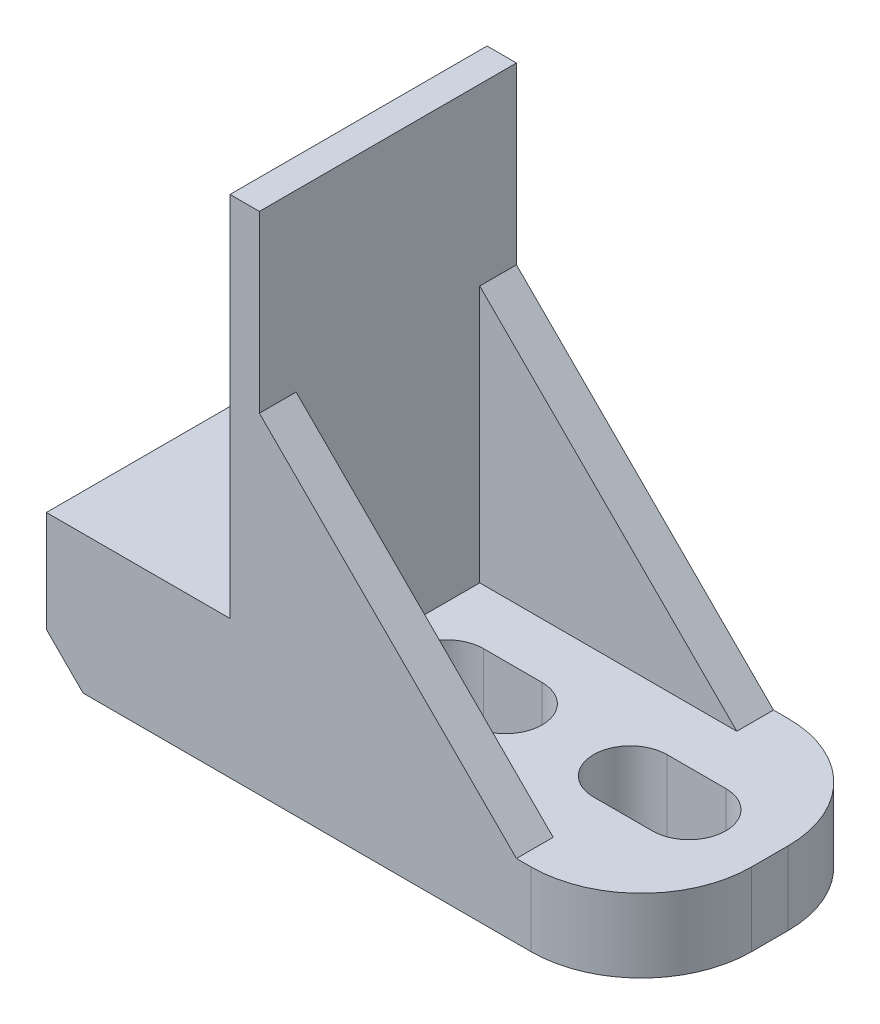
ISO-10303-21;
HEADER;
FILE_DESCRIPTION(('STEP AP214'),'2;1');
FILE_NAME('part.step','',(''),(''),'','','');
FILE_SCHEMA(('AUTOMOTIVE_DESIGN { 1 0 10303 214 1 1 1 1 }'));
ENDSEC;
DATA;
#1=APPLICATION_CONTEXT('core data for automotive mechanical design processes');
#2=APPLICATION_PROTOCOL_DEFINITION('international standard','automotive_design',2000,#1);
#3=PRODUCT_CONTEXT('',#1,'mechanical');
#4=PRODUCT('Part','Part','',(#3));
#5=PRODUCT_RELATED_PRODUCT_CATEGORY('part','',(#4));
#6=PRODUCT_DEFINITION_FORMATION('','',#4);
#7=PRODUCT_DEFINITION_CONTEXT('part definition',#1,'design');
#8=PRODUCT_DEFINITION('design','',#6,#7);
#9=PRODUCT_DEFINITION_SHAPE('','',#8);
#10=(LENGTH_UNIT() NAMED_UNIT(*) SI_UNIT(.MILLI.,.METRE.));
#11=(NAMED_UNIT(*) PLANE_ANGLE_UNIT() SI_UNIT($,.RADIAN.));
#12=(NAMED_UNIT(*) SI_UNIT($,.STERADIAN.) SOLID_ANGLE_UNIT());
#13=UNCERTAINTY_MEASURE_WITH_UNIT(LENGTH_MEASURE(1.E-05),#10,'distance_accuracy_value','');
#14=(GEOMETRIC_REPRESENTATION_CONTEXT(3) GLOBAL_UNCERTAINTY_ASSIGNED_CONTEXT((#13)) GLOBAL_UNIT_ASSIGNED_CONTEXT((#10,
#11,#12)) REPRESENTATION_CONTEXT('',''));
#15=CARTESIAN_POINT('',(0.,0.,0.));
#16=DIRECTION('',(0.,0.,1.));
#17=DIRECTION('',(1.,0.,0.));
#18=AXIS2_PLACEMENT_3D('',#15,#16,#17);
#19=CARTESIAN_POINT('',(-93.5405405405406,-10.2324324324324,35.));
#20=DIRECTION('',(0.,-1.,0.));
#21=DIRECTION('',(1.,0.,0.));
#22=AXIS2_PLACEMENT_3D('',#19,#20,#21);
#23=PLANE('',#22);
#24=DIRECTION('',(-1.,0.,0.));
#25=VECTOR('',#24,1.);
#26=CARTESIAN_POINT('',(-93.5405405405406,-10.2324324324324,22.5));
#27=LINE('',#26,#25);
#28=CARTESIAN_POINT('',(-77.5405405405406,-10.2324324324324,22.5));
#29=VERTEX_POINT('',#28);
#30=CARTESIAN_POINT('',(-85.5405405405406,-10.2324324324324,22.5));
#31=VERTEX_POINT('',#30);
#32=EDGE_CURVE('E265',#29,#31,#27,.T.);
#33=ORIENTED_EDGE('',*,*,#32,.T.);
#34=CARTESIAN_POINT('',(-85.5405405405406,-10.2324324324324,17.5));
#35=DIRECTION('',(0.,-1.,0.));
#36=DIRECTION('',(1.,0.,0.));
#37=AXIS2_PLACEMENT_3D('',#34,#35,#36);
#38=CIRCLE('',#37,5.);
#39=CARTESIAN_POINT('',(-85.5405405405406,-10.2324324324324,12.5));
#40=VERTEX_POINT('',#39);
#41=EDGE_CURVE('E202',#31,#40,#38,.T.);
#42=ORIENTED_EDGE('',*,*,#41,.T.);
#43=DIRECTION('',(1.,0.,0.));
#44=VECTOR('',#43,1.);
#45=CARTESIAN_POINT('',(-93.5405405405406,-10.2324324324324,12.5));
#46=LINE('',#45,#44);
#47=CARTESIAN_POINT('',(-77.5405405405406,-10.2324324324324,12.5));
#48=VERTEX_POINT('',#47);
#49=EDGE_CURVE('E270',#40,#48,#46,.T.);
#50=ORIENTED_EDGE('',*,*,#49,.T.);
#51=CARTESIAN_POINT('',(-77.5405405405406,-10.2324324324324,17.5));
#52=DIRECTION('',(0.,-1.,0.));
#53=DIRECTION('',(1.,0.,0.));
#54=AXIS2_PLACEMENT_3D('',#51,#52,#53);
#55=CIRCLE('',#54,5.);
#56=EDGE_CURVE('E267',#48,#29,#55,.T.);
#57=ORIENTED_EDGE('',*,*,#56,.T.);
#58=EDGE_LOOP('',(#33,#42,#50,#57));
#59=FACE_BOUND('',#58,.T.);
#60=DIRECTION('',(-1.,0.,0.));
#61=VECTOR('',#60,1.);
#62=CARTESIAN_POINT('',(-93.5405405405406,-10.2324324324324,22.5));
#63=LINE('',#62,#61);
#64=CARTESIAN_POINT('',(-52.5405405405406,-10.2324324324324,22.5));
#65=VERTEX_POINT('',#64);
#66=CARTESIAN_POINT('',(-60.5405405405406,-10.2324324324324,22.5));
#67=VERTEX_POINT('',#66);
#68=EDGE_CURVE('E230',#65,#67,#63,.T.);
#69=ORIENTED_EDGE('',*,*,#68,.T.);
#70=CARTESIAN_POINT('',(-60.5405405405406,-10.2324324324324,17.5));
#71=DIRECTION('',(0.,-1.,0.));
#72=DIRECTION('',(1.,0.,0.));
#73=AXIS2_PLACEMENT_3D('',#70,#71,#72);
#74=CIRCLE('',#73,5.);
#75=CARTESIAN_POINT('',(-60.5405405405406,-10.2324324324324,12.5));
#76=VERTEX_POINT('',#75);
#77=EDGE_CURVE('E262',#67,#76,#74,.T.);
#78=ORIENTED_EDGE('',*,*,#77,.T.);
#79=DIRECTION('',(1.,0.,0.));
#80=VECTOR('',#79,1.);
#81=CARTESIAN_POINT('',(-93.5405405405406,-10.2324324324324,12.5));
#82=LINE('',#81,#80);
#83=CARTESIAN_POINT('',(-52.5405405405406,-10.2324324324324,12.5));
#84=VERTEX_POINT('',#83);
#85=EDGE_CURVE('E259',#76,#84,#82,.T.);
#86=ORIENTED_EDGE('',*,*,#85,.T.);
#87=CARTESIAN_POINT('',(-52.5405405405406,-10.2324324324324,17.5));
#88=DIRECTION('',(0.,-1.,0.));
#89=DIRECTION('',(1.,0.,0.));
#90=AXIS2_PLACEMENT_3D('',#87,#88,#89);
#91=CIRCLE('',#90,5.);
#92=EDGE_CURVE('E256',#84,#65,#91,.T.);
#93=ORIENTED_EDGE('',*,*,#92,.T.);
#94=EDGE_LOOP('',(#69,#78,#86,#93));
#95=FACE_BOUND('',#94,.T.);
#96=DIRECTION('',(0.,0.,-1.));
#97=VECTOR('',#96,1.);
#98=CARTESIAN_POINT('',(-41.5405405405406,-10.2324324324324,35.));
#99=LINE('',#98,#97);
#100=CARTESIAN_POINT('',(-41.5405405405406,-10.2324324324324,20.));
#101=VERTEX_POINT('',#100);
#102=CARTESIAN_POINT('',(-41.5405405405406,-10.2324324324324,15.));
#103=VERTEX_POINT('',#102);
#104=EDGE_CURVE('E355',#101,#103,#99,.T.);
#105=ORIENTED_EDGE('',*,*,#104,.T.);
#106=CARTESIAN_POINT('',(-56.5405405405406,-10.2324324324324,15.));
#107=DIRECTION('',(0.,-1.,0.));
#108=DIRECTION('',(1.,0.,0.));
#109=AXIS2_PLACEMENT_3D('',#106,#107,#108);
#110=CIRCLE('',#109,15.);
#111=CARTESIAN_POINT('',(-56.5405405405406,-10.2324324324324,0.));
#112=VERTEX_POINT('',#111);
#113=EDGE_CURVE('E374',#103,#112,#110,.F.);
#114=ORIENTED_EDGE('',*,*,#113,.T.);
#115=DIRECTION('',(-1.,0.,0.));
#116=VECTOR('',#115,1.);
#117=CARTESIAN_POINT('',(-93.5405405405406,-10.2324324324324,0.));
#118=LINE('',#117,#116);
#119=CARTESIAN_POINT('',(-58.5405405405406,-10.2324324324324,0.));
#120=VERTEX_POINT('',#119);
#121=EDGE_CURVE('E308',#112,#120,#118,.T.);
#122=ORIENTED_EDGE('',*,*,#121,.T.);
#123=DIRECTION('',(0.,0.,-1.));
#124=VECTOR('',#123,1.);
#125=CARTESIAN_POINT('',(-58.5405405405406,-10.2324324324324,5.));
#126=LINE('',#125,#124);
#127=CARTESIAN_POINT('',(-58.5405405405406,-10.2324324324324,5.));
#128=VERTEX_POINT('',#127);
#129=EDGE_CURVE('E301',#128,#120,#126,.T.);
#130=ORIENTED_EDGE('',*,*,#129,.F.);
#131=DIRECTION('',(1.,0.,0.));
#132=VECTOR('',#131,1.);
#133=CARTESIAN_POINT('',(-93.5405405405406,-10.2324324324324,5.));
#134=LINE('',#133,#132);
#135=CARTESIAN_POINT('',(-93.5405405405406,-10.2324324324324,5.));
#136=VERTEX_POINT('',#135);
#137=EDGE_CURVE('E298',#136,#128,#134,.T.);
#138=ORIENTED_EDGE('',*,*,#137,.F.);
#139=DIRECTION('',(0.,0.,-1.));
#140=VECTOR('',#139,1.);
#141=CARTESIAN_POINT('',(-93.5405405405406,-10.2324324324324,35.));
#142=LINE('',#141,#140);
#143=CARTESIAN_POINT('',(-93.5405405405406,-10.2324324324324,30.));
#144=VERTEX_POINT('',#143);
#145=EDGE_CURVE('E353',#144,#136,#142,.T.);
#146=ORIENTED_EDGE('',*,*,#145,.F.);
#147=DIRECTION('',(1.,0.,0.));
#148=VECTOR('',#147,1.);
#149=CARTESIAN_POINT('',(0.,-10.2324324324324,30.));
#150=LINE('',#149,#148);
#151=CARTESIAN_POINT('',(-58.5405405405406,-10.2324324324324,30.));
#152=VERTEX_POINT('',#151);
#153=EDGE_CURVE('E281',#144,#152,#150,.T.);
#154=ORIENTED_EDGE('',*,*,#153,.T.);
#155=DIRECTION('',(0.,0.,1.));
#156=VECTOR('',#155,1.);
#157=CARTESIAN_POINT('',(-58.5405405405406,-10.2324324324324,30.));
#158=LINE('',#157,#156);
#159=CARTESIAN_POINT('',(-58.5405405405406,-10.2324324324324,35.));
#160=VERTEX_POINT('',#159);
#161=EDGE_CURVE('E286',#152,#160,#158,.T.);
#162=ORIENTED_EDGE('',*,*,#161,.T.);
#163=DIRECTION('',(-1.,0.,0.));
#164=VECTOR('',#163,1.);
#165=CARTESIAN_POINT('',(-93.5405405405406,-10.2324324324324,35.));
#166=LINE('',#165,#164);
#167=CARTESIAN_POINT('',(-56.5405405405406,-10.2324324324324,35.));
#168=VERTEX_POINT('',#167);
#169=EDGE_CURVE('E309',#168,#160,#166,.T.);
#170=ORIENTED_EDGE('',*,*,#169,.F.);
#171=CARTESIAN_POINT('',(-56.5405405405406,-10.2324324324324,20.));
#172=DIRECTION('',(0.,-1.,0.));
#173=DIRECTION('',(1.,0.,0.));
#174=AXIS2_PLACEMENT_3D('',#171,#172,#173);
#175=CIRCLE('',#174,15.);
#176=EDGE_CURVE('E372',#168,#101,#175,.F.);
#177=ORIENTED_EDGE('',*,*,#176,.T.);
#178=EDGE_LOOP('',(#105,#114,#122,#130,#138,#146,#154,#162,#170,#177));
#179=FACE_BOUND('',#178,.T.);
#180=ADVANCED_FACE('F35',(#59,#95,#179),#23,.F.);
#181=CARTESIAN_POINT('',(-93.5405405405406,48.5675675675676,35.));
#182=DIRECTION('',(-1.,0.,0.));
#183=DIRECTION('',(0.,0.,1.));
#184=AXIS2_PLACEMENT_3D('',#181,#182,#183);
#185=PLANE('',#184);
#186=DIRECTION('',(0.,1.,0.));
#187=VECTOR('',#186,1.);
#188=CARTESIAN_POINT('',(-93.5405405405406,48.5675675675676,35.));
#189=LINE('',#188,#187);
#190=CARTESIAN_POINT('',(-93.5405405405406,24.7675675675676,35.));
#191=VERTEX_POINT('',#190);
#192=CARTESIAN_POINT('',(-93.5405405405406,48.5675675675676,35.));
#193=VERTEX_POINT('',#192);
#194=EDGE_CURVE('E311',#191,#193,#189,.T.);
#195=ORIENTED_EDGE('',*,*,#194,.F.);
#196=DIRECTION('',(0.,0.,1.));
#197=VECTOR('',#196,1.);
#198=CARTESIAN_POINT('',(-93.5405405405406,24.7675675675676,30.));
#199=LINE('',#198,#197);
#200=CARTESIAN_POINT('',(-93.5405405405406,24.7675675675676,30.));
#201=VERTEX_POINT('',#200);
#202=EDGE_CURVE('E284',#201,#191,#199,.T.);
#203=ORIENTED_EDGE('',*,*,#202,.F.);
#204=DIRECTION('',(0.,-1.,0.));
#205=VECTOR('',#204,1.);
#206=CARTESIAN_POINT('',(-93.5405405405406,0.,30.));
#207=LINE('',#206,#205);
#208=EDGE_CURVE('E278',#201,#144,#207,.T.);
#209=ORIENTED_EDGE('',*,*,#208,.T.);
#210=ORIENTED_EDGE('',*,*,#145,.T.);
#211=DIRECTION('',(0.,-1.,0.));
#212=VECTOR('',#211,1.);
#213=CARTESIAN_POINT('',(-93.5405405405406,24.7675675675676,5.));
#214=LINE('',#213,#212);
#215=CARTESIAN_POINT('',(-93.5405405405406,24.7675675675676,5.));
#216=VERTEX_POINT('',#215);
#217=EDGE_CURVE('E295',#216,#136,#214,.T.);
#218=ORIENTED_EDGE('',*,*,#217,.F.);
#219=DIRECTION('',(0.,0.,-1.));
#220=VECTOR('',#219,1.);
#221=CARTESIAN_POINT('',(-93.5405405405406,24.7675675675676,5.));
#222=LINE('',#221,#220);
#223=CARTESIAN_POINT('',(-93.5405405405406,24.7675675675676,0.));
#224=VERTEX_POINT('',#223);
#225=EDGE_CURVE('E306',#216,#224,#222,.T.);
#226=ORIENTED_EDGE('',*,*,#225,.T.);
#227=DIRECTION('',(0.,1.,0.));
#228=VECTOR('',#227,1.);
#229=CARTESIAN_POINT('',(-93.5405405405406,48.5675675675676,0.));
#230=LINE('',#229,#228);
#231=CARTESIAN_POINT('',(-93.5405405405406,48.5675675675676,0.));
#232=VERTEX_POINT('',#231);
#233=EDGE_CURVE('E327',#224,#232,#230,.T.);
#234=ORIENTED_EDGE('',*,*,#233,.T.);
#235=DIRECTION('',(0.,0.,-1.));
#236=VECTOR('',#235,1.);
#237=CARTESIAN_POINT('',(-93.5405405405406,48.5675675675676,35.));
#238=LINE('',#237,#236);
#239=EDGE_CURVE('E350',#193,#232,#238,.T.);
#240=ORIENTED_EDGE('',*,*,#239,.F.);
#241=EDGE_LOOP('',(#195,#203,#209,#210,#218,#226,#234,#240));
#242=FACE_BOUND('',#241,.T.);
#243=ADVANCED_FACE('F400',(#242),#185,.F.);
#244=CARTESIAN_POINT('',(-41.5405405405406,-10.2324324324324,35.));
#245=DIRECTION('',(-1.,0.,0.));
#246=DIRECTION('',(0.,0.,1.));
#247=AXIS2_PLACEMENT_3D('',#244,#245,#246);
#248=PLANE('',#247);
#249=DIRECTION('',(0.,0.,-1.));
#250=VECTOR('',#249,1.);
#251=CARTESIAN_POINT('',(-41.5405405405406,-20.2324324324324,35.));
#252=LINE('',#251,#250);
#253=CARTESIAN_POINT('',(-41.5405405405406,-20.2324324324324,20.));
#254=VERTEX_POINT('',#253);
#255=CARTESIAN_POINT('',(-41.5405405405406,-20.2324324324324,15.));
#256=VERTEX_POINT('',#255);
#257=EDGE_CURVE('E325',#254,#256,#252,.T.);
#258=ORIENTED_EDGE('',*,*,#257,.T.);
#259=DIRECTION('',(0.,1.,0.));
#260=VECTOR('',#259,1.);
#261=CARTESIAN_POINT('',(-41.5405405405406,-10.2324324324324,15.));
#262=LINE('',#261,#260);
#263=EDGE_CURVE('E369',#256,#103,#262,.T.);
#264=ORIENTED_EDGE('',*,*,#263,.T.);
#265=ORIENTED_EDGE('',*,*,#104,.F.);
#266=DIRECTION('',(0.,1.,0.));
#267=VECTOR('',#266,1.);
#268=CARTESIAN_POINT('',(-41.5405405405406,-10.2324324324324,20.));
#269=LINE('',#268,#267);
#270=EDGE_CURVE('E367',#101,#254,#269,.F.);
#271=ORIENTED_EDGE('',*,*,#270,.T.);
#272=EDGE_LOOP('',(#258,#264,#265,#271));
#273=FACE_BOUND('',#272,.T.);
#274=ADVANCED_FACE('F381',(#273),#248,.F.);
#275=CARTESIAN_POINT('',(-97.5405405405406,48.5675675675676,35.));
#276=DIRECTION('',(0.,-1.,0.));
#277=DIRECTION('',(0.,0.,-1.));
#278=AXIS2_PLACEMENT_3D('',#275,#276,#277);
#279=PLANE('',#278);
#280=DIRECTION('',(-1.,0.,0.));
#281=VECTOR('',#280,1.);
#282=CARTESIAN_POINT('',(-97.5405405405406,48.5675675675676,0.));
#283=LINE('',#282,#281);
#284=CARTESIAN_POINT('',(-97.5405405405406,48.5675675675676,0.));
#285=VERTEX_POINT('',#284);
#286=EDGE_CURVE('E329',#232,#285,#283,.T.);
#287=ORIENTED_EDGE('',*,*,#286,.T.);
#288=DIRECTION('',(0.,0.,-1.));
#289=VECTOR('',#288,1.);
#290=CARTESIAN_POINT('',(-97.5405405405406,48.5675675675676,35.));
#291=LINE('',#290,#289);
#292=CARTESIAN_POINT('',(-97.5405405405406,48.5675675675676,35.));
#293=VERTEX_POINT('',#292);
#294=EDGE_CURVE('E347',#293,#285,#291,.T.);
#295=ORIENTED_EDGE('',*,*,#294,.F.);
#296=DIRECTION('',(-1.,0.,0.));
#297=VECTOR('',#296,1.);
#298=CARTESIAN_POINT('',(-97.5405405405406,48.5675675675676,35.));
#299=LINE('',#298,#297);
#300=EDGE_CURVE('E314',#193,#293,#299,.T.);
#301=ORIENTED_EDGE('',*,*,#300,.F.);
#302=ORIENTED_EDGE('',*,*,#239,.T.);
#303=EDGE_LOOP('',(#287,#295,#301,#302));
#304=FACE_BOUND('',#303,.T.);
#305=ADVANCED_FACE('F434',(#304),#279,.F.);
#306=CARTESIAN_POINT('',(-97.5405405405406,-1.43243243243243,35.));
#307=DIRECTION('',(1.,0.,0.));
#308=DIRECTION('',(0.,0.,-1.));
#309=AXIS2_PLACEMENT_3D('',#306,#307,#308);
#310=PLANE('',#309);
#311=DIRECTION('',(0.,-1.,0.));
#312=VECTOR('',#311,1.);
#313=CARTESIAN_POINT('',(-97.5405405405406,-1.43243243243243,0.));
#314=LINE('',#313,#312);
#315=CARTESIAN_POINT('',(-97.5405405405406,-1.43243243243243,0.));
#316=VERTEX_POINT('',#315);
#317=EDGE_CURVE('E331',#285,#316,#314,.T.);
#318=ORIENTED_EDGE('',*,*,#317,.T.);
#319=DIRECTION('',(0.,0.,-1.));
#320=VECTOR('',#319,1.);
#321=CARTESIAN_POINT('',(-97.5405405405406,-1.43243243243243,35.));
#322=LINE('',#321,#320);
#323=CARTESIAN_POINT('',(-97.5405405405406,-1.43243243243243,35.));
#324=VERTEX_POINT('',#323);
#325=EDGE_CURVE('E344',#324,#316,#322,.T.);
#326=ORIENTED_EDGE('',*,*,#325,.F.);
#327=DIRECTION('',(0.,-1.,0.));
#328=VECTOR('',#327,1.);
#329=CARTESIAN_POINT('',(-97.5405405405406,-1.43243243243243,35.));
#330=LINE('',#329,#328);
#331=EDGE_CURVE('E316',#293,#324,#330,.T.);
#332=ORIENTED_EDGE('',*,*,#331,.F.);
#333=ORIENTED_EDGE('',*,*,#294,.T.);
#334=EDGE_LOOP('',(#318,#326,#332,#333));
#335=FACE_BOUND('',#334,.T.);
#336=ADVANCED_FACE('F459',(#335),#310,.F.);
#337=CARTESIAN_POINT('',(-122.540540540541,-1.43243243243243,35.));
#338=DIRECTION('',(0.,-1.,0.));
#339=DIRECTION('',(1.,0.,0.));
#340=AXIS2_PLACEMENT_3D('',#337,#338,#339);
#341=PLANE('',#340);
#342=DIRECTION('',(-1.,0.,0.));
#343=VECTOR('',#342,1.);
#344=CARTESIAN_POINT('',(-122.540540540541,-1.43243243243243,0.));
#345=LINE('',#344,#343);
#346=CARTESIAN_POINT('',(-122.540540540541,-1.43243243243243,0.));
#347=VERTEX_POINT('',#346);
#348=EDGE_CURVE('E333',#316,#347,#345,.T.);
#349=ORIENTED_EDGE('',*,*,#348,.T.);
#350=DIRECTION('',(0.,0.,-1.));
#351=VECTOR('',#350,1.);
#352=CARTESIAN_POINT('',(-122.540540540541,-1.43243243243243,35.));
#353=LINE('',#352,#351);
#354=CARTESIAN_POINT('',(-122.540540540541,-1.43243243243243,35.));
#355=VERTEX_POINT('',#354);
#356=EDGE_CURVE('E341',#355,#347,#353,.T.);
#357=ORIENTED_EDGE('',*,*,#356,.F.);
#358=DIRECTION('',(-1.,0.,0.));
#359=VECTOR('',#358,1.);
#360=CARTESIAN_POINT('',(-122.540540540541,-1.43243243243243,35.));
#361=LINE('',#360,#359);
#362=EDGE_CURVE('E318',#324,#355,#361,.T.);
#363=ORIENTED_EDGE('',*,*,#362,.F.);
#364=ORIENTED_EDGE('',*,*,#325,.T.);
#365=EDGE_LOOP('',(#349,#357,#363,#364));
#366=FACE_BOUND('',#365,.T.);
#367=ADVANCED_FACE('F455',(#366),#341,.F.);
#368=CARTESIAN_POINT('',(-122.540540540541,-20.2324324324324,35.));
#369=DIRECTION('',(1.,0.,0.));
#370=DIRECTION('',(0.,0.,-1.));
#371=AXIS2_PLACEMENT_3D('',#368,#369,#370);
#372=PLANE('',#371);
#373=DIRECTION('',(0.,-1.,0.));
#374=VECTOR('',#373,1.);
#375=CARTESIAN_POINT('',(-122.540540540541,-20.2324324324324,0.));
#376=LINE('',#375,#374);
#377=CARTESIAN_POINT('',(-122.540540540541,-15.2324324324324,0.));
#378=VERTEX_POINT('',#377);
#379=EDGE_CURVE('E335',#347,#378,#376,.T.);
#380=ORIENTED_EDGE('',*,*,#379,.T.);
#381=DIRECTION('',(0.,0.,1.));
#382=VECTOR('',#381,1.);
#383=CARTESIAN_POINT('',(-122.540540540541,-15.2324324324324,35.));
#384=LINE('',#383,#382);
#385=CARTESIAN_POINT('',(-122.540540540541,-15.2324324324324,35.));
#386=VERTEX_POINT('',#385);
#387=EDGE_CURVE('E363',#378,#386,#384,.T.);
#388=ORIENTED_EDGE('',*,*,#387,.T.);
#389=DIRECTION('',(0.,-1.,0.));
#390=VECTOR('',#389,1.);
#391=CARTESIAN_POINT('',(-122.540540540541,-20.2324324324324,35.));
#392=LINE('',#391,#390);
#393=EDGE_CURVE('E320',#355,#386,#392,.T.);
#394=ORIENTED_EDGE('',*,*,#393,.F.);
#395=ORIENTED_EDGE('',*,*,#356,.T.);
#396=EDGE_LOOP('',(#380,#388,#394,#395));
#397=FACE_BOUND('',#396,.T.);
#398=ADVANCED_FACE('F451',(#397),#372,.F.);
#399=CARTESIAN_POINT('',(-41.5405405405406,-20.2324324324324,35.));
#400=DIRECTION('',(0.,1.,0.));
#401=DIRECTION('',(-1.,0.,0.));
#402=AXIS2_PLACEMENT_3D('',#399,#400,#401);
#403=PLANE('',#402);
#404=DIRECTION('',(-1.,0.,0.));
#405=VECTOR('',#404,1.);
#406=CARTESIAN_POINT('',(-85.5405405405406,-20.2324324324324,12.5));
#407=LINE('',#406,#405);
#408=CARTESIAN_POINT('',(-77.5405405405406,-20.2324324324324,12.5));
#409=VERTEX_POINT('',#408);
#410=CARTESIAN_POINT('',(-85.5405405405406,-20.2324324324324,12.5));
#411=VERTEX_POINT('',#410);
#412=EDGE_CURVE('E206',#409,#411,#407,.T.);
#413=ORIENTED_EDGE('',*,*,#412,.T.);
#414=CARTESIAN_POINT('',(-85.5405405405406,-20.2324324324324,17.5));
#415=DIRECTION('',(0.,1.,0.));
#416=DIRECTION('',(0.,0.,1.));
#417=AXIS2_PLACEMENT_3D('',#414,#415,#416);
#418=CIRCLE('',#417,5.);
#419=CARTESIAN_POINT('',(-85.5405405405406,-20.2324324324324,22.5));
#420=VERTEX_POINT('',#419);
#421=EDGE_CURVE('E199',#411,#420,#418,.T.);
#422=ORIENTED_EDGE('',*,*,#421,.T.);
#423=DIRECTION('',(1.,0.,0.));
#424=VECTOR('',#423,1.);
#425=CARTESIAN_POINT('',(-85.5405405405406,-20.2324324324324,22.5));
#426=LINE('',#425,#424);
#427=CARTESIAN_POINT('',(-77.5405405405406,-20.2324324324324,22.5));
#428=VERTEX_POINT('',#427);
#429=EDGE_CURVE('E210',#420,#428,#426,.T.);
#430=ORIENTED_EDGE('',*,*,#429,.T.);
#431=CARTESIAN_POINT('',(-77.5405405405406,-20.2324324324324,17.5));
#432=DIRECTION('',(0.,1.,0.));
#433=DIRECTION('',(0.,0.,1.));
#434=AXIS2_PLACEMENT_3D('',#431,#432,#433);
#435=CIRCLE('',#434,5.);
#436=EDGE_CURVE('E215',#428,#409,#435,.T.);
#437=ORIENTED_EDGE('',*,*,#436,.T.);
#438=EDGE_LOOP('',(#413,#422,#430,#437));
#439=FACE_BOUND('',#438,.T.);
#440=DIRECTION('',(-1.,0.,0.));
#441=VECTOR('',#440,1.);
#442=CARTESIAN_POINT('',(-60.5405405405406,-20.2324324324324,12.5));
#443=LINE('',#442,#441);
#444=CARTESIAN_POINT('',(-52.5405405405406,-20.2324324324324,12.5));
#445=VERTEX_POINT('',#444);
#446=CARTESIAN_POINT('',(-60.5405405405406,-20.2324324324324,12.5));
#447=VERTEX_POINT('',#446);
#448=EDGE_CURVE('E244',#445,#447,#443,.T.);
#449=ORIENTED_EDGE('',*,*,#448,.T.);
#450=CARTESIAN_POINT('',(-60.5405405405406,-20.2324324324324,17.5));
#451=DIRECTION('',(0.,1.,0.));
#452=DIRECTION('',(0.,0.,1.));
#453=AXIS2_PLACEMENT_3D('',#450,#451,#452);
#454=CIRCLE('',#453,5.);
#455=CARTESIAN_POINT('',(-60.5405405405406,-20.2324324324324,22.5));
#456=VERTEX_POINT('',#455);
#457=EDGE_CURVE('E235',#447,#456,#454,.T.);
#458=ORIENTED_EDGE('',*,*,#457,.T.);
#459=DIRECTION('',(1.,0.,0.));
#460=VECTOR('',#459,1.);
#461=CARTESIAN_POINT('',(-60.5405405405406,-20.2324324324324,22.5));
#462=LINE('',#461,#460);
#463=CARTESIAN_POINT('',(-52.5405405405406,-20.2324324324324,22.5));
#464=VERTEX_POINT('',#463);
#465=EDGE_CURVE('E238',#456,#464,#462,.T.);
#466=ORIENTED_EDGE('',*,*,#465,.T.);
#467=CARTESIAN_POINT('',(-52.5405405405406,-20.2324324324324,17.5));
#468=DIRECTION('',(0.,1.,0.));
#469=DIRECTION('',(0.,0.,1.));
#470=AXIS2_PLACEMENT_3D('',#467,#468,#469);
#471=CIRCLE('',#470,5.);
#472=EDGE_CURVE('E241',#464,#445,#471,.T.);
#473=ORIENTED_EDGE('',*,*,#472,.T.);
#474=EDGE_LOOP('',(#449,#458,#466,#473));
#475=FACE_BOUND('',#474,.T.);
#476=DIRECTION('',(1.,0.,0.));
#477=VECTOR('',#476,1.);
#478=CARTESIAN_POINT('',(-41.5405405405406,-20.2324324324324,0.));
#479=LINE('',#478,#477);
#480=CARTESIAN_POINT('',(-117.540540540541,-20.2324324324324,0.));
#481=VERTEX_POINT('',#480);
#482=CARTESIAN_POINT('',(-56.5405405405406,-20.2324324324324,0.));
#483=VERTEX_POINT('',#482);
#484=EDGE_CURVE('E312',#481,#483,#479,.T.);
#485=ORIENTED_EDGE('',*,*,#484,.T.);
#486=CARTESIAN_POINT('',(-56.5405405405406,-20.2324324324324,15.));
#487=DIRECTION('',(0.,1.,0.));
#488=DIRECTION('',(-1.,0.,0.));
#489=AXIS2_PLACEMENT_3D('',#486,#487,#488);
#490=CIRCLE('',#489,15.);
#491=EDGE_CURVE('E43',#483,#256,#490,.F.);
#492=ORIENTED_EDGE('',*,*,#491,.T.);
#493=ORIENTED_EDGE('',*,*,#257,.F.);
#494=CARTESIAN_POINT('',(-56.5405405405406,-20.2324324324324,20.));
#495=DIRECTION('',(0.,1.,0.));
#496=DIRECTION('',(-1.,0.,0.));
#497=AXIS2_PLACEMENT_3D('',#494,#495,#496);
#498=CIRCLE('',#497,15.);
#499=CARTESIAN_POINT('',(-56.5405405405406,-20.2324324324324,35.));
#500=VERTEX_POINT('',#499);
#501=EDGE_CURVE('E50',#254,#500,#498,.F.);
#502=ORIENTED_EDGE('',*,*,#501,.T.);
#503=DIRECTION('',(1.,0.,0.));
#504=VECTOR('',#503,1.);
#505=CARTESIAN_POINT('',(-41.5405405405406,-20.2324324324324,35.));
#506=LINE('',#505,#504);
#507=CARTESIAN_POINT('',(-117.540540540541,-20.2324324324324,35.));
#508=VERTEX_POINT('',#507);
#509=EDGE_CURVE('E323',#508,#500,#506,.T.);
#510=ORIENTED_EDGE('',*,*,#509,.F.);
#511=DIRECTION('',(0.,0.,-1.));
#512=VECTOR('',#511,1.);
#513=CARTESIAN_POINT('',(-117.540540540541,-20.2324324324324,35.));
#514=LINE('',#513,#512);
#515=EDGE_CURVE('E358',#508,#481,#514,.T.);
#516=ORIENTED_EDGE('',*,*,#515,.T.);
#517=EDGE_LOOP('',(#485,#492,#493,#502,#510,#516));
#518=FACE_BOUND('',#517,.T.);
#519=ADVANCED_FACE('F217',(#439,#475,#518),#403,.F.);
#520=CARTESIAN_POINT('',(0.,0.,35.));
#521=DIRECTION('',(0.,0.,-1.));
#522=DIRECTION('',(-1.,0.,0.));
#523=AXIS2_PLACEMENT_3D('',#520,#521,#522);
#524=PLANE('',#523);
#525=ORIENTED_EDGE('',*,*,#509,.T.);
#526=DIRECTION('',(0.,1.,0.));
#527=VECTOR('',#526,1.);
#528=CARTESIAN_POINT('',(-56.5405405405406,0.,35.));
#529=LINE('',#528,#527);
#530=EDGE_CURVE('E11',#500,#168,#529,.T.);
#531=ORIENTED_EDGE('',*,*,#530,.T.);
#532=ORIENTED_EDGE('',*,*,#169,.T.);
#533=DIRECTION('',(-0.707106781186548,0.707106781186548,0.));
#534=VECTOR('',#533,1.);
#535=CARTESIAN_POINT('',(-34.3864864864865,-34.3864864864865,35.));
#536=LINE('',#535,#534);
#537=EDGE_CURVE('E274',#160,#191,#536,.T.);
#538=ORIENTED_EDGE('',*,*,#537,.T.);
#539=ORIENTED_EDGE('',*,*,#194,.T.);
#540=ORIENTED_EDGE('',*,*,#300,.T.);
#541=ORIENTED_EDGE('',*,*,#331,.T.);
#542=ORIENTED_EDGE('',*,*,#362,.T.);
#543=ORIENTED_EDGE('',*,*,#393,.T.);
#544=DIRECTION('',(-0.707106781186547,0.707106781186549,0.));
#545=VECTOR('',#544,1.);
#546=CARTESIAN_POINT('',(-117.540540540541,-20.2324324324324,35.));
#547=LINE('',#546,#545);
#548=EDGE_CURVE('E365',#386,#508,#547,.F.);
#549=ORIENTED_EDGE('',*,*,#548,.T.);
#550=EDGE_LOOP('',(#525,#531,#532,#538,#539,#540,#541,#542,#543,#549));
#551=FACE_BOUND('',#550,.T.);
#552=ADVANCED_FACE('F412',(#551),#524,.F.);
#553=CARTESIAN_POINT('',(0.,0.,0.));
#554=DIRECTION('',(0.,0.,-1.));
#555=DIRECTION('',(-1.,0.,0.));
#556=AXIS2_PLACEMENT_3D('',#553,#554,#555);
#557=PLANE('',#556);
#558=ORIENTED_EDGE('',*,*,#121,.F.);
#559=DIRECTION('',(0.,1.,0.));
#560=VECTOR('',#559,1.);
#561=CARTESIAN_POINT('',(-56.5405405405406,-20.2324324324324,0.));
#562=LINE('',#561,#560);
#563=EDGE_CURVE('E58',#112,#483,#562,.F.);
#564=ORIENTED_EDGE('',*,*,#563,.T.);
#565=ORIENTED_EDGE('',*,*,#484,.F.);
#566=DIRECTION('',(0.707106781186547,-0.707106781186549,0.));
#567=VECTOR('',#566,1.);
#568=CARTESIAN_POINT('',(-68.8864864864867,-68.8864864864865,0.));
#569=LINE('',#568,#567);
#570=EDGE_CURVE('E361',#481,#378,#569,.F.);
#571=ORIENTED_EDGE('',*,*,#570,.T.);
#572=ORIENTED_EDGE('',*,*,#379,.F.);
#573=ORIENTED_EDGE('',*,*,#348,.F.);
#574=ORIENTED_EDGE('',*,*,#317,.F.);
#575=ORIENTED_EDGE('',*,*,#286,.F.);
#576=ORIENTED_EDGE('',*,*,#233,.F.);
#577=DIRECTION('',(-0.707106781186548,0.707106781186548,0.));
#578=VECTOR('',#577,1.);
#579=CARTESIAN_POINT('',(-58.5405405405406,-10.2324324324324,0.));
#580=LINE('',#579,#578);
#581=EDGE_CURVE('E289',#120,#224,#580,.T.);
#582=ORIENTED_EDGE('',*,*,#581,.F.);
#583=EDGE_LOOP('',(#558,#564,#565,#571,#572,#573,#574,#575,#576,#582));
#584=FACE_BOUND('',#583,.T.);
#585=ADVANCED_FACE('F387',(#584),#557,.T.);
#586=CARTESIAN_POINT('',(-58.5405405405406,-10.2324324324324,5.));
#587=DIRECTION('',(-0.707106781186548,-0.707106781186548,0.));
#588=DIRECTION('',(0.707106781186548,-0.707106781186548,0.));
#589=AXIS2_PLACEMENT_3D('',#586,#587,#588);
#590=PLANE('',#589);
#591=ORIENTED_EDGE('',*,*,#581,.T.);
#592=ORIENTED_EDGE('',*,*,#225,.F.);
#593=DIRECTION('',(-0.707106781186548,0.707106781186548,0.));
#594=VECTOR('',#593,1.);
#595=CARTESIAN_POINT('',(-58.5405405405406,-10.2324324324324,5.));
#596=LINE('',#595,#594);
#597=EDGE_CURVE('E292',#128,#216,#596,.T.);
#598=ORIENTED_EDGE('',*,*,#597,.F.);
#599=ORIENTED_EDGE('',*,*,#129,.T.);
#600=EDGE_LOOP('',(#591,#592,#598,#599));
#601=FACE_BOUND('',#600,.T.);
#602=ADVANCED_FACE('F392',(#601),#590,.F.);
#603=CARTESIAN_POINT('',(0.,0.,5.));
#604=DIRECTION('',(0.,0.,1.));
#605=DIRECTION('',(1.,0.,0.));
#606=AXIS2_PLACEMENT_3D('',#603,#604,#605);
#607=PLANE('',#606);
#608=ORIENTED_EDGE('',*,*,#597,.T.);
#609=ORIENTED_EDGE('',*,*,#217,.T.);
#610=ORIENTED_EDGE('',*,*,#137,.T.);
#611=EDGE_LOOP('',(#608,#609,#610));
#612=FACE_BOUND('',#611,.T.);
#613=ADVANCED_FACE('F397',(#612),#607,.T.);
#614=CARTESIAN_POINT('',(-34.3864864864865,-34.3864864864865,30.));
#615=DIRECTION('',(0.707106781186548,0.707106781186548,0.));
#616=DIRECTION('',(-0.707106781186548,0.707106781186548,0.));
#617=AXIS2_PLACEMENT_3D('',#614,#615,#616);
#618=PLANE('',#617);
#619=ORIENTED_EDGE('',*,*,#537,.F.);
#620=ORIENTED_EDGE('',*,*,#161,.F.);
#621=DIRECTION('',(-0.707106781186548,0.707106781186548,0.));
#622=VECTOR('',#621,1.);
#623=CARTESIAN_POINT('',(-34.3864864864865,-34.3864864864865,30.));
#624=LINE('',#623,#622);
#625=EDGE_CURVE('E275',#152,#201,#624,.T.);
#626=ORIENTED_EDGE('',*,*,#625,.T.);
#627=ORIENTED_EDGE('',*,*,#202,.T.);
#628=EDGE_LOOP('',(#619,#620,#626,#627));
#629=FACE_BOUND('',#628,.T.);
#630=ADVANCED_FACE('F408',(#629),#618,.T.);
#631=CARTESIAN_POINT('',(0.,0.,30.));
#632=DIRECTION('',(0.,0.,1.));
#633=DIRECTION('',(1.,0.,0.));
#634=AXIS2_PLACEMENT_3D('',#631,#632,#633);
#635=PLANE('',#634);
#636=ORIENTED_EDGE('',*,*,#625,.F.);
#637=ORIENTED_EDGE('',*,*,#153,.F.);
#638=ORIENTED_EDGE('',*,*,#208,.F.);
#639=EDGE_LOOP('',(#636,#637,#638));
#640=FACE_BOUND('',#639,.T.);
#641=ADVANCED_FACE('F405',(#640),#635,.F.);
#642=CARTESIAN_POINT('',(-60.5405405405406,-20.2324324324324,17.5));
#643=DIRECTION('',(0.,1.,0.));
#644=DIRECTION('',(0.,0.,1.));
#645=AXIS2_PLACEMENT_3D('',#642,#643,#644);
#646=CYLINDRICAL_SURFACE('',#645,5.);
#647=DIRECTION('',(0.,1.,0.));
#648=VECTOR('',#647,1.);
#649=CARTESIAN_POINT('',(-60.5405405405406,-20.2324324324324,22.5));
#650=LINE('',#649,#648);
#651=EDGE_CURVE('E246',#456,#67,#650,.T.);
#652=ORIENTED_EDGE('',*,*,#651,.F.);
#653=ORIENTED_EDGE('',*,*,#457,.F.);
#654=DIRECTION('',(0.,1.,0.));
#655=VECTOR('',#654,1.);
#656=CARTESIAN_POINT('',(-60.5405405405406,-20.2324324324324,12.5));
#657=LINE('',#656,#655);
#658=EDGE_CURVE('E220',#447,#76,#657,.T.);
#659=ORIENTED_EDGE('',*,*,#658,.T.);
#660=ORIENTED_EDGE('',*,*,#77,.F.);
#661=EDGE_LOOP('',(#652,#653,#659,#660));
#662=FACE_BOUND('',#661,.T.);
#663=ADVANCED_FACE('F487',(#662),#646,.F.);
#664=CARTESIAN_POINT('',(-60.5405405405406,-20.2324324324324,12.5));
#665=DIRECTION('',(0.,0.,-1.));
#666=DIRECTION('',(-1.,0.,0.));
#667=AXIS2_PLACEMENT_3D('',#664,#665,#666);
#668=PLANE('',#667);
#669=ORIENTED_EDGE('',*,*,#658,.F.);
#670=ORIENTED_EDGE('',*,*,#448,.F.);
#671=DIRECTION('',(0.,1.,0.));
#672=VECTOR('',#671,1.);
#673=CARTESIAN_POINT('',(-52.5405405405406,-20.2324324324324,12.5));
#674=LINE('',#673,#672);
#675=EDGE_CURVE('E223',#445,#84,#674,.T.);
#676=ORIENTED_EDGE('',*,*,#675,.T.);
#677=ORIENTED_EDGE('',*,*,#85,.F.);
#678=EDGE_LOOP('',(#669,#670,#676,#677));
#679=FACE_BOUND('',#678,.T.);
#680=ADVANCED_FACE('F490',(#679),#668,.F.);
#681=CARTESIAN_POINT('',(-52.5405405405406,-20.2324324324324,17.5));
#682=DIRECTION('',(0.,1.,0.));
#683=DIRECTION('',(0.,0.,1.));
#684=AXIS2_PLACEMENT_3D('',#681,#682,#683);
#685=CYLINDRICAL_SURFACE('',#684,5.);
#686=ORIENTED_EDGE('',*,*,#675,.F.);
#687=ORIENTED_EDGE('',*,*,#472,.F.);
#688=DIRECTION('',(0.,1.,0.));
#689=VECTOR('',#688,1.);
#690=CARTESIAN_POINT('',(-52.5405405405406,-20.2324324324324,22.5));
#691=LINE('',#690,#689);
#692=EDGE_CURVE('E250',#464,#65,#691,.T.);
#693=ORIENTED_EDGE('',*,*,#692,.T.);
#694=ORIENTED_EDGE('',*,*,#92,.F.);
#695=EDGE_LOOP('',(#686,#687,#693,#694));
#696=FACE_BOUND('',#695,.T.);
#697=ADVANCED_FACE('F495',(#696),#685,.F.);
#698=CARTESIAN_POINT('',(-60.5405405405406,-20.2324324324324,22.5));
#699=DIRECTION('',(0.,0.,1.));
#700=DIRECTION('',(1.,0.,0.));
#701=AXIS2_PLACEMENT_3D('',#698,#699,#700);
#702=PLANE('',#701);
#703=ORIENTED_EDGE('',*,*,#692,.F.);
#704=ORIENTED_EDGE('',*,*,#465,.F.);
#705=ORIENTED_EDGE('',*,*,#651,.T.);
#706=ORIENTED_EDGE('',*,*,#68,.F.);
#707=EDGE_LOOP('',(#703,#704,#705,#706));
#708=FACE_BOUND('',#707,.T.);
#709=ADVANCED_FACE('F492',(#708),#702,.F.);
#710=CARTESIAN_POINT('',(-85.5405405405406,-20.2324324324324,17.5));
#711=DIRECTION('',(0.,1.,0.));
#712=DIRECTION('',(0.,0.,1.));
#713=AXIS2_PLACEMENT_3D('',#710,#711,#712);
#714=CYLINDRICAL_SURFACE('',#713,5.);
#715=DIRECTION('',(0.,1.,0.));
#716=VECTOR('',#715,1.);
#717=CARTESIAN_POINT('',(-85.5405405405406,-20.2324324324324,22.5));
#718=LINE('',#717,#716);
#719=EDGE_CURVE('E194',#420,#31,#718,.T.);
#720=ORIENTED_EDGE('',*,*,#719,.F.);
#721=ORIENTED_EDGE('',*,*,#421,.F.);
#722=DIRECTION('',(0.,1.,0.));
#723=VECTOR('',#722,1.);
#724=CARTESIAN_POINT('',(-85.5405405405406,-20.2324324324324,12.5));
#725=LINE('',#724,#723);
#726=EDGE_CURVE('E228',#411,#40,#725,.T.);
#727=ORIENTED_EDGE('',*,*,#726,.T.);
#728=ORIENTED_EDGE('',*,*,#41,.F.);
#729=EDGE_LOOP('',(#720,#721,#727,#728));
#730=FACE_BOUND('',#729,.T.);
#731=ADVANCED_FACE('F196',(#730),#714,.F.);
#732=CARTESIAN_POINT('',(-85.5405405405406,-20.2324324324324,12.5));
#733=DIRECTION('',(0.,0.,-1.));
#734=DIRECTION('',(-1.,0.,0.));
#735=AXIS2_PLACEMENT_3D('',#732,#733,#734);
#736=PLANE('',#735);
#737=ORIENTED_EDGE('',*,*,#726,.F.);
#738=ORIENTED_EDGE('',*,*,#412,.F.);
#739=DIRECTION('',(0.,1.,0.));
#740=VECTOR('',#739,1.);
#741=CARTESIAN_POINT('',(-77.5405405405406,-20.2324324324324,12.5));
#742=LINE('',#741,#740);
#743=EDGE_CURVE('E231',#409,#48,#742,.T.);
#744=ORIENTED_EDGE('',*,*,#743,.T.);
#745=ORIENTED_EDGE('',*,*,#49,.F.);
#746=EDGE_LOOP('',(#737,#738,#744,#745));
#747=FACE_BOUND('',#746,.T.);
#748=ADVANCED_FACE('F504',(#747),#736,.F.);
#749=CARTESIAN_POINT('',(-77.5405405405406,-20.2324324324324,17.5));
#750=DIRECTION('',(0.,1.,0.));
#751=DIRECTION('',(0.,0.,1.));
#752=AXIS2_PLACEMENT_3D('',#749,#750,#751);
#753=CYLINDRICAL_SURFACE('',#752,5.);
#754=ORIENTED_EDGE('',*,*,#743,.F.);
#755=ORIENTED_EDGE('',*,*,#436,.F.);
#756=DIRECTION('',(0.,1.,0.));
#757=VECTOR('',#756,1.);
#758=CARTESIAN_POINT('',(-77.5405405405406,-20.2324324324324,22.5));
#759=LINE('',#758,#757);
#760=EDGE_CURVE('E205',#428,#29,#759,.T.);
#761=ORIENTED_EDGE('',*,*,#760,.T.);
#762=ORIENTED_EDGE('',*,*,#56,.F.);
#763=EDGE_LOOP('',(#754,#755,#761,#762));
#764=FACE_BOUND('',#763,.T.);
#765=ADVANCED_FACE('F442',(#764),#753,.F.);
#766=CARTESIAN_POINT('',(-85.5405405405406,-20.2324324324324,22.5));
#767=DIRECTION('',(0.,0.,1.));
#768=DIRECTION('',(1.,0.,0.));
#769=AXIS2_PLACEMENT_3D('',#766,#767,#768);
#770=PLANE('',#769);
#771=ORIENTED_EDGE('',*,*,#760,.F.);
#772=ORIENTED_EDGE('',*,*,#429,.F.);
#773=ORIENTED_EDGE('',*,*,#719,.T.);
#774=ORIENTED_EDGE('',*,*,#32,.F.);
#775=EDGE_LOOP('',(#771,#772,#773,#774));
#776=FACE_BOUND('',#775,.T.);
#777=ADVANCED_FACE('F211',(#776),#770,.F.);
#778=CARTESIAN_POINT('',(-117.540540540541,-20.2324324324324,35.));
#779=DIRECTION('',(0.707106781186548,0.707106781186546,0.));
#780=DIRECTION('',(0.,0.,-1.));
#781=AXIS2_PLACEMENT_3D('',#778,#779,#780);
#782=PLANE('',#781);
#783=ORIENTED_EDGE('',*,*,#548,.F.);
#784=ORIENTED_EDGE('',*,*,#387,.F.);
#785=ORIENTED_EDGE('',*,*,#570,.F.);
#786=ORIENTED_EDGE('',*,*,#515,.F.);
#787=EDGE_LOOP('',(#783,#784,#785,#786));
#788=FACE_BOUND('',#787,.T.);
#789=ADVANCED_FACE('F420',(#788),#782,.F.);
#790=CARTESIAN_POINT('',(-56.5405405405406,-10.2324324324324,15.));
#791=DIRECTION('',(0.,-1.,0.));
#792=DIRECTION('',(0.,0.,-1.));
#793=AXIS2_PLACEMENT_3D('',#790,#791,#792);
#794=CYLINDRICAL_SURFACE('',#793,15.);
#795=ORIENTED_EDGE('',*,*,#491,.F.);
#796=ORIENTED_EDGE('',*,*,#563,.F.);
#797=ORIENTED_EDGE('',*,*,#113,.F.);
#798=ORIENTED_EDGE('',*,*,#263,.F.);
#799=EDGE_LOOP('',(#795,#796,#797,#798));
#800=FACE_BOUND('',#799,.T.);
#801=ADVANCED_FACE('F384',(#800),#794,.T.);
#802=CARTESIAN_POINT('',(-56.5405405405406,0.,20.));
#803=DIRECTION('',(0.,1.,0.));
#804=DIRECTION('',(0.,0.,1.));
#805=AXIS2_PLACEMENT_3D('',#802,#803,#804);
#806=CYLINDRICAL_SURFACE('',#805,15.);
#807=ORIENTED_EDGE('',*,*,#501,.F.);
#808=ORIENTED_EDGE('',*,*,#270,.F.);
#809=ORIENTED_EDGE('',*,*,#176,.F.);
#810=ORIENTED_EDGE('',*,*,#530,.F.);
#811=EDGE_LOOP('',(#807,#808,#809,#810));
#812=FACE_BOUND('',#811,.T.);
#813=ADVANCED_FACE('F37',(#812),#806,.T.);
#814=CLOSED_SHELL('',(#180,#243,#274,#305,#336,#367,#398,#519,#552,#585,#602,#613,#630,#641,
#663,#680,#697,#709,#731,#748,#765,#777,#789,#801,#813));
#815=MANIFOLD_SOLID_BREP('B2',#814);
#816=ADVANCED_BREP_SHAPE_REPRESENTATION('',(#18,#815),#14);
#817=SHAPE_DEFINITION_REPRESENTATION(#9,#816);
ENDSEC;
END-ISO-10303-21;
